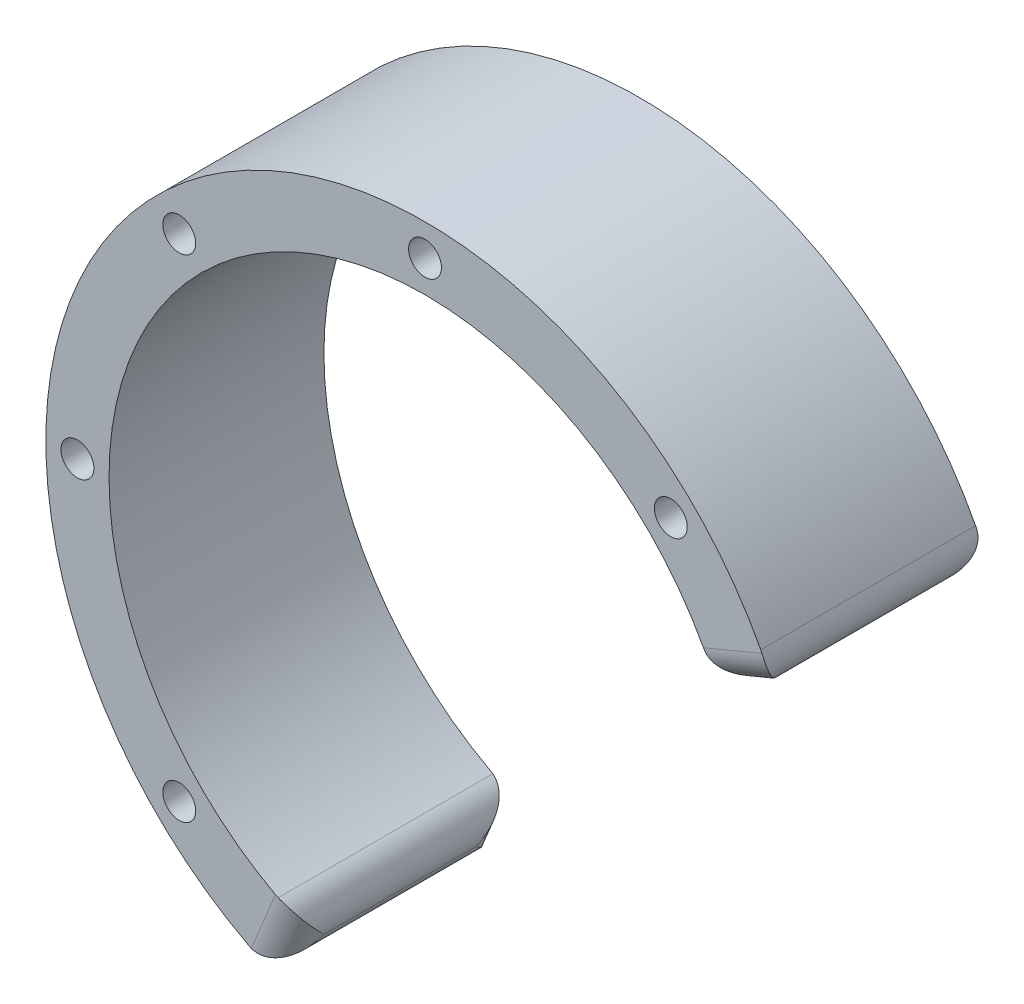
ISO-10303-21;
HEADER;
FILE_DESCRIPTION(('STEP AP214'),'2;1');
FILE_NAME('part.step','',(''),(''),'','','');
FILE_SCHEMA(('AUTOMOTIVE_DESIGN { 1 0 10303 214 1 1 1 1 }'));
ENDSEC;
DATA;
#1=APPLICATION_CONTEXT('core data for automotive mechanical design processes');
#2=APPLICATION_PROTOCOL_DEFINITION('international standard','automotive_design',2000,#1);
#3=PRODUCT_CONTEXT('',#1,'mechanical');
#4=PRODUCT('Part','Part','',(#3));
#5=PRODUCT_RELATED_PRODUCT_CATEGORY('part','',(#4));
#6=PRODUCT_DEFINITION_FORMATION('','',#4);
#7=PRODUCT_DEFINITION_CONTEXT('part definition',#1,'design');
#8=PRODUCT_DEFINITION('design','',#6,#7);
#9=PRODUCT_DEFINITION_SHAPE('','',#8);
#10=(LENGTH_UNIT() NAMED_UNIT(*) SI_UNIT(.MILLI.,.METRE.));
#11=(NAMED_UNIT(*) PLANE_ANGLE_UNIT() SI_UNIT($,.RADIAN.));
#12=(NAMED_UNIT(*) SI_UNIT($,.STERADIAN.) SOLID_ANGLE_UNIT());
#13=UNCERTAINTY_MEASURE_WITH_UNIT(LENGTH_MEASURE(1.E-05),#10,'distance_accuracy_value','');
#14=(GEOMETRIC_REPRESENTATION_CONTEXT(3) GLOBAL_UNCERTAINTY_ASSIGNED_CONTEXT((#13)) GLOBAL_UNIT_ASSIGNED_CONTEXT((#10,
#11,#12)) REPRESENTATION_CONTEXT('',''));
#15=CARTESIAN_POINT('',(0.,0.,0.));
#16=DIRECTION('',(0.,0.,1.));
#17=DIRECTION('',(1.,0.,0.));
#18=AXIS2_PLACEMENT_3D('',#15,#16,#17);
#19=CARTESIAN_POINT('',(0.,0.,-34.));
#20=DIRECTION('',(0.,0.,-1.));
#21=DIRECTION('',(1.,0.,0.));
#22=AXIS2_PLACEMENT_3D('',#19,#20,#21);
#23=PLANE('',#22);
#24=CARTESIAN_POINT('',(-55.,0.,-34.));
#25=DIRECTION('',(0.,0.,1.));
#26=DIRECTION('',(1.,0.,0.));
#27=AXIS2_PLACEMENT_3D('',#24,#25,#26);
#28=CIRCLE('',#27,2.6);
#29=CARTESIAN_POINT('',(-52.4,0.,-34.));
#30=VERTEX_POINT('',#29);
#31=EDGE_CURVE('E505',#30,#30,#28,.T.);
#32=ORIENTED_EDGE('',*,*,#31,.T.);
#33=EDGE_LOOP('',(#32));
#34=FACE_BOUND('',#33,.T.);
#35=CARTESIAN_POINT('',(0.,55.,-34.));
#36=DIRECTION('',(0.,0.,1.));
#37=DIRECTION('',(1.,0.,0.));
#38=AXIS2_PLACEMENT_3D('',#35,#36,#37);
#39=CIRCLE('',#38,2.6);
#40=CARTESIAN_POINT('',(2.6,55.,-34.));
#41=VERTEX_POINT('',#40);
#42=EDGE_CURVE('E484',#41,#41,#39,.T.);
#43=ORIENTED_EDGE('',*,*,#42,.T.);
#44=EDGE_LOOP('',(#43));
#45=FACE_BOUND('',#44,.T.);
#46=CARTESIAN_POINT('',(38.8908729652601,38.8908729652601,-34.));
#47=DIRECTION('',(0.,0.,1.));
#48=DIRECTION('',(1.,0.,0.));
#49=AXIS2_PLACEMENT_3D('',#46,#47,#48);
#50=CIRCLE('',#49,2.6);
#51=CARTESIAN_POINT('',(41.4908729652601,38.8908729652601,-34.));
#52=VERTEX_POINT('',#51);
#53=EDGE_CURVE('E490',#52,#52,#50,.T.);
#54=ORIENTED_EDGE('',*,*,#53,.T.);
#55=EDGE_LOOP('',(#54));
#56=FACE_BOUND('',#55,.T.);
#57=CARTESIAN_POINT('',(-38.8908729652601,-38.8908729652601,-34.));
#58=DIRECTION('',(0.,0.,1.));
#59=DIRECTION('',(1.,0.,0.));
#60=AXIS2_PLACEMENT_3D('',#57,#58,#59);
#61=CIRCLE('',#60,2.6);
#62=CARTESIAN_POINT('',(-36.2908729652601,-38.8908729652601,-34.));
#63=VERTEX_POINT('',#62);
#64=EDGE_CURVE('E499',#63,#63,#61,.T.);
#65=ORIENTED_EDGE('',*,*,#64,.T.);
#66=EDGE_LOOP('',(#65));
#67=FACE_BOUND('',#66,.T.);
#68=CARTESIAN_POINT('',(-38.8908729652601,38.8908729652601,-34.));
#69=DIRECTION('',(0.,0.,1.));
#70=DIRECTION('',(1.,0.,0.));
#71=AXIS2_PLACEMENT_3D('',#68,#69,#70);
#72=CIRCLE('',#71,2.6);
#73=CARTESIAN_POINT('',(-36.2908729652601,38.8908729652601,-34.));
#74=VERTEX_POINT('',#73);
#75=EDGE_CURVE('E513',#74,#74,#72,.T.);
#76=ORIENTED_EDGE('',*,*,#75,.T.);
#77=EDGE_LOOP('',(#76));
#78=FACE_BOUND('',#77,.T.);
#79=DIRECTION('',(0.923879532511288,0.382683432365087,0.));
#80=VECTOR('',#79,1.);
#81=CARTESIAN_POINT('',(-1.91341716182544,4.61939766255644,-34.));
#82=LINE('',#81,#80);
#83=CARTESIAN_POINT('',(44.049009250608,23.6576580421616,-34.));
#84=VERTEX_POINT('',#83);
#85=CARTESIAN_POINT('',(53.308946538107,27.493249653368,-34.));
#86=VERTEX_POINT('',#85);
#87=EDGE_CURVE('E244',#84,#86,#82,.T.);
#88=ORIENTED_EDGE('',*,*,#87,.F.);
#89=CARTESIAN_POINT('',(0.,0.,-34.));
#90=DIRECTION('',(0.,0.,1.));
#91=DIRECTION('',(1.,0.,0.));
#92=AXIS2_PLACEMENT_3D('',#89,#90,#91);
#93=CIRCLE('',#92,50.);
#94=CARTESIAN_POINT('',(-23.6576580421617,-44.0490092506079,-34.));
#95=VERTEX_POINT('',#94);
#96=EDGE_CURVE('E292',#84,#95,#93,.T.);
#97=ORIENTED_EDGE('',*,*,#96,.T.);
#98=DIRECTION('',(-0.382683432365091,-0.923879532511287,0.));
#99=VECTOR('',#98,1.);
#100=CARTESIAN_POINT('',(-23.753569280811,-44.2805594637389,-34.));
#101=LINE('',#100,#99);
#102=CARTESIAN_POINT('',(-27.4932496533681,-53.3089465381069,-34.));
#103=VERTEX_POINT('',#102);
#104=EDGE_CURVE('E236',#103,#95,#101,.F.);
#105=ORIENTED_EDGE('',*,*,#104,.F.);
#106=CARTESIAN_POINT('',(-25.5798324915427,-48.6895488755505,-34.));
#107=DIRECTION('',(0.,0.,1.));
#108=DIRECTION('',(1.,0.,0.));
#109=AXIS2_PLACEMENT_3D('',#106,#107,#108);
#110=CIRCLE('',#109,5.);
#111=CARTESIAN_POINT('',(-27.9052718089557,-53.1158715006005,-34.));
#112=VERTEX_POINT('',#111);
#113=EDGE_CURVE('E240',#112,#103,#110,.T.);
#114=ORIENTED_EDGE('',*,*,#113,.F.);
#115=CARTESIAN_POINT('',(0.,0.,-34.));
#116=DIRECTION('',(0.,0.,1.));
#117=DIRECTION('',(1.,0.,0.));
#118=AXIS2_PLACEMENT_3D('',#115,#116,#117);
#119=CIRCLE('',#118,60.);
#120=CARTESIAN_POINT('',(53.1158715006006,27.9052718089555,-34.));
#121=VERTEX_POINT('',#120);
#122=EDGE_CURVE('E221',#121,#112,#119,.T.);
#123=ORIENTED_EDGE('',*,*,#122,.F.);
#124=CARTESIAN_POINT('',(48.6895488755505,25.5798324915425,-34.));
#125=DIRECTION('',(0.,0.,1.));
#126=DIRECTION('',(1.,0.,0.));
#127=AXIS2_PLACEMENT_3D('',#124,#125,#126);
#128=CIRCLE('',#127,5.);
#129=EDGE_CURVE('E249',#86,#121,#128,.T.);
#130=ORIENTED_EDGE('',*,*,#129,.F.);
#131=EDGE_LOOP('',(#88,#97,#105,#114,#123,#130));
#132=FACE_BOUND('',#131,.T.);
#133=ADVANCED_FACE('F45',(#34,#45,#56,#67,#78,#132),#23,.T.);
#134=CARTESIAN_POINT('',(0.,0.,0.));
#135=DIRECTION('',(0.,0.,-1.));
#136=DIRECTION('',(1.,0.,0.));
#137=AXIS2_PLACEMENT_3D('',#134,#135,#136);
#138=PLANE('',#137);
#139=CARTESIAN_POINT('',(-38.8908729652601,38.8908729652601,0.));
#140=DIRECTION('',(0.,0.,1.));
#141=DIRECTION('',(1.,0.,0.));
#142=AXIS2_PLACEMENT_3D('',#139,#140,#141);
#143=CIRCLE('',#142,2.6);
#144=CARTESIAN_POINT('',(-36.2908729652601,38.8908729652601,0.));
#145=VERTEX_POINT('',#144);
#146=EDGE_CURVE('E516',#145,#145,#143,.T.);
#147=ORIENTED_EDGE('',*,*,#146,.F.);
#148=EDGE_LOOP('',(#147));
#149=FACE_BOUND('',#148,.T.);
#150=CARTESIAN_POINT('',(-55.,0.,0.));
#151=DIRECTION('',(0.,0.,1.));
#152=DIRECTION('',(1.,0.,0.));
#153=AXIS2_PLACEMENT_3D('',#150,#151,#152);
#154=CIRCLE('',#153,2.6);
#155=CARTESIAN_POINT('',(-52.4,0.,0.));
#156=VERTEX_POINT('',#155);
#157=EDGE_CURVE('E509',#156,#156,#154,.T.);
#158=ORIENTED_EDGE('',*,*,#157,.F.);
#159=EDGE_LOOP('',(#158));
#160=FACE_BOUND('',#159,.T.);
#161=CARTESIAN_POINT('',(-38.8908729652601,-38.8908729652601,0.));
#162=DIRECTION('',(0.,0.,1.));
#163=DIRECTION('',(1.,0.,0.));
#164=AXIS2_PLACEMENT_3D('',#161,#162,#163);
#165=CIRCLE('',#164,2.6);
#166=CARTESIAN_POINT('',(-36.2908729652601,-38.8908729652601,0.));
#167=VERTEX_POINT('',#166);
#168=EDGE_CURVE('E501',#167,#167,#165,.T.);
#169=ORIENTED_EDGE('',*,*,#168,.F.);
#170=EDGE_LOOP('',(#169));
#171=FACE_BOUND('',#170,.T.);
#172=CARTESIAN_POINT('',(38.8908729652601,38.8908729652601,0.));
#173=DIRECTION('',(0.,0.,1.));
#174=DIRECTION('',(1.,0.,0.));
#175=AXIS2_PLACEMENT_3D('',#172,#173,#174);
#176=CIRCLE('',#175,2.6);
#177=CARTESIAN_POINT('',(41.4908729652601,38.8908729652601,0.));
#178=VERTEX_POINT('',#177);
#179=EDGE_CURVE('E494',#178,#178,#176,.T.);
#180=ORIENTED_EDGE('',*,*,#179,.F.);
#181=EDGE_LOOP('',(#180));
#182=FACE_BOUND('',#181,.T.);
#183=CARTESIAN_POINT('',(0.,55.,0.));
#184=DIRECTION('',(0.,0.,1.));
#185=DIRECTION('',(1.,0.,0.));
#186=AXIS2_PLACEMENT_3D('',#183,#184,#185);
#187=CIRCLE('',#186,2.6);
#188=CARTESIAN_POINT('',(2.6,55.,0.));
#189=VERTEX_POINT('',#188);
#190=EDGE_CURVE('E487',#189,#189,#187,.T.);
#191=ORIENTED_EDGE('',*,*,#190,.F.);
#192=EDGE_LOOP('',(#191));
#193=FACE_BOUND('',#192,.T.);
#194=CARTESIAN_POINT('',(0.,0.,0.));
#195=DIRECTION('',(0.,0.,1.));
#196=DIRECTION('',(1.,0.,0.));
#197=AXIS2_PLACEMENT_3D('',#194,#195,#196);
#198=CIRCLE('',#197,60.);
#199=CARTESIAN_POINT('',(53.1158715006006,27.9052718089555,0.));
#200=VERTEX_POINT('',#199);
#201=CARTESIAN_POINT('',(-27.9052718089557,-53.1158715006005,0.));
#202=VERTEX_POINT('',#201);
#203=EDGE_CURVE('E237',#200,#202,#198,.T.);
#204=ORIENTED_EDGE('',*,*,#203,.T.);
#205=CARTESIAN_POINT('',(-25.5798324915427,-48.6895488755505,0.));
#206=DIRECTION('',(0.,0.,1.));
#207=DIRECTION('',(1.,0.,0.));
#208=AXIS2_PLACEMENT_3D('',#205,#206,#207);
#209=CIRCLE('',#208,5.);
#210=CARTESIAN_POINT('',(-27.4932496533681,-53.3089465381069,0.));
#211=VERTEX_POINT('',#210);
#212=EDGE_CURVE('E260',#211,#202,#209,.F.);
#213=ORIENTED_EDGE('',*,*,#212,.F.);
#214=DIRECTION('',(-0.382683432365091,-0.923879532511287,0.));
#215=VECTOR('',#214,1.);
#216=CARTESIAN_POINT('',(-4.61939766255643,1.91341716182545,0.));
#217=LINE('',#216,#215);
#218=CARTESIAN_POINT('',(-23.6576580421617,-44.0490092506079,0.));
#219=VERTEX_POINT('',#218);
#220=EDGE_CURVE('E113',#219,#211,#217,.T.);
#221=ORIENTED_EDGE('',*,*,#220,.F.);
#222=CARTESIAN_POINT('',(0.,0.,0.));
#223=DIRECTION('',(0.,0.,1.));
#224=DIRECTION('',(1.,0.,0.));
#225=AXIS2_PLACEMENT_3D('',#222,#223,#224);
#226=CIRCLE('',#225,50.);
#227=CARTESIAN_POINT('',(44.049009250608,23.6576580421616,0.));
#228=VERTEX_POINT('',#227);
#229=EDGE_CURVE('E130',#228,#219,#226,.T.);
#230=ORIENTED_EDGE('',*,*,#229,.F.);
#231=DIRECTION('',(0.923879532511288,0.382683432365087,0.));
#232=VECTOR('',#231,1.);
#233=CARTESIAN_POINT('',(44.280559463739,23.7535692808108,0.));
#234=LINE('',#233,#232);
#235=CARTESIAN_POINT('',(53.308946538107,27.493249653368,0.));
#236=VERTEX_POINT('',#235);
#237=EDGE_CURVE('E265',#236,#228,#234,.F.);
#238=ORIENTED_EDGE('',*,*,#237,.F.);
#239=CARTESIAN_POINT('',(48.6895488755505,25.5798324915425,0.));
#240=DIRECTION('',(0.,0.,1.));
#241=DIRECTION('',(1.,0.,0.));
#242=AXIS2_PLACEMENT_3D('',#239,#240,#241);
#243=CIRCLE('',#242,5.);
#244=EDGE_CURVE('E268',#200,#236,#243,.F.);
#245=ORIENTED_EDGE('',*,*,#244,.F.);
#246=EDGE_LOOP('',(#204,#213,#221,#230,#238,#245));
#247=FACE_BOUND('',#246,.T.);
#248=ADVANCED_FACE('F200',(#149,#160,#171,#182,#193,#247),#138,.F.);
#249=CARTESIAN_POINT('',(0.,0.,-34.));
#250=DIRECTION('',(0.,0.,1.));
#251=DIRECTION('',(-1.,0.,0.));
#252=AXIS2_PLACEMENT_3D('',#249,#250,#251);
#253=CYLINDRICAL_SURFACE('',#252,60.);
#254=ORIENTED_EDGE('',*,*,#122,.T.);
#255=DIRECTION('',(0.,0.,1.));
#256=VECTOR('',#255,1.);
#257=CARTESIAN_POINT('',(-27.9052718089557,-53.1158715006005,-34.));
#258=LINE('',#257,#256);
#259=EDGE_CURVE('E226',#202,#112,#258,.F.);
#260=ORIENTED_EDGE('',*,*,#259,.F.);
#261=ORIENTED_EDGE('',*,*,#203,.F.);
#262=DIRECTION('',(0.,0.,1.));
#263=VECTOR('',#262,1.);
#264=CARTESIAN_POINT('',(53.1158715006006,27.9052718089555,-34.));
#265=LINE('',#264,#263);
#266=EDGE_CURVE('E229',#121,#200,#265,.T.);
#267=ORIENTED_EDGE('',*,*,#266,.F.);
#268=EDGE_LOOP('',(#254,#260,#261,#267));
#269=FACE_BOUND('',#268,.T.);
#270=ADVANCED_FACE('F157',(#269),#253,.T.);
#271=CARTESIAN_POINT('',(0.,0.,-34.));
#272=DIRECTION('',(0.,0.,1.));
#273=DIRECTION('',(-1.,0.,0.));
#274=AXIS2_PLACEMENT_3D('',#271,#272,#273);
#275=CYLINDRICAL_SURFACE('',#274,50.);
#276=ORIENTED_EDGE('',*,*,#229,.T.);
#277=CARTESIAN_POINT('',(-23.2543931741297,-44.2632262505004,-0.0207040226803054));
#278=CARTESIAN_POINT('',(-23.3216288534228,-44.2279037169782,-0.0138028967598055));
#279=CARTESIAN_POINT('',(-23.3888520987387,-44.1923910335594,-0.00862699857619675));
#280=CARTESIAN_POINT('',(-23.5232737214161,-44.1209853669285,-0.00172565768276146));
#281=CARTESIAN_POINT('',(-23.5904720987775,-44.0850923837165,-2.14972935010914E-07));
#282=CARTESIAN_POINT('',(-23.6576580421617,-44.0490092506079,0.));
#283=B_SPLINE_CURVE_WITH_KNOTS('',3,(#277,#278,#279,#280,#281,#282),.UNSPECIFIED.,.F.,.F.,(4,2,
4),(0.,0.228609159588413,0.457218319176832),.UNSPECIFIED.);
#284=CARTESIAN_POINT('',(-23.2543931741297,-44.2632262505004,-0.0207040226803054));
#285=VERTEX_POINT('',#284);
#286=EDGE_CURVE('E174',#285,#219,#283,.T.);
#287=ORIENTED_EDGE('',*,*,#286,.F.);
#288=DIRECTION('',(0.,0.,1.));
#289=VECTOR('',#288,1.);
#290=CARTESIAN_POINT('',(-23.2543931741297,-44.2632262505004,-34.));
#291=LINE('',#290,#289);
#292=CARTESIAN_POINT('',(-23.2543931741297,-44.2632262505004,-33.9792959773197));
#293=VERTEX_POINT('',#292);
#294=EDGE_CURVE('E106',#293,#285,#291,.T.);
#295=ORIENTED_EDGE('',*,*,#294,.F.);
#296=CARTESIAN_POINT('',(-23.6576580421617,-44.0490092506079,-34.));
#297=CARTESIAN_POINT('',(-23.5904720987775,-44.0850923837165,-33.9999997850271));
#298=CARTESIAN_POINT('',(-23.5232737214161,-44.1209853669285,-33.9982743423172));
#299=CARTESIAN_POINT('',(-23.3888520987387,-44.1923910335594,-33.9913730014238));
#300=CARTESIAN_POINT('',(-23.3216288534228,-44.2279037169782,-33.9861971032402));
#301=CARTESIAN_POINT('',(-23.2543931741297,-44.2632262505004,-33.9792959773197));
#302=B_SPLINE_CURVE_WITH_KNOTS('',3,(#296,#297,#298,#299,#300,#301),.UNSPECIFIED.,.F.,.F.,(4,2,
4),(0.,0.228609159588419,0.457218319176836),.UNSPECIFIED.);
#303=EDGE_CURVE('E164',#95,#293,#302,.T.);
#304=ORIENTED_EDGE('',*,*,#303,.F.);
#305=ORIENTED_EDGE('',*,*,#96,.F.);
#306=CARTESIAN_POINT('',(44.2632262505005,23.2543931741296,-33.9792959773197));
#307=CARTESIAN_POINT('',(44.2279037169783,23.3216288534227,-33.9861971032402));
#308=CARTESIAN_POINT('',(44.1923910335594,23.3888520987386,-33.9913730014238));
#309=CARTESIAN_POINT('',(44.1209853669286,23.5232737214159,-33.9982743423172));
#310=CARTESIAN_POINT('',(44.0850923837166,23.5904720987774,-33.9999997850271));
#311=CARTESIAN_POINT('',(44.049009250608,23.6576580421616,-34.));
#312=B_SPLINE_CURVE_WITH_KNOTS('',3,(#306,#307,#308,#309,#310,#311),.UNSPECIFIED.,.F.,.F.,(4,2,
4),(0.,0.228609159588414,0.45721831917683),.UNSPECIFIED.);
#313=CARTESIAN_POINT('',(44.2632262505005,23.2543931741296,-33.9792959773197));
#314=VERTEX_POINT('',#313);
#315=EDGE_CURVE('E179',#314,#84,#312,.T.);
#316=ORIENTED_EDGE('',*,*,#315,.F.);
#317=DIRECTION('',(0.,0.,1.));
#318=VECTOR('',#317,1.);
#319=CARTESIAN_POINT('',(44.2632262505005,23.2543931741296,-34.));
#320=LINE('',#319,#318);
#321=CARTESIAN_POINT('',(44.2632262505005,23.2543931741296,-0.0207040226803054));
#322=VERTEX_POINT('',#321);
#323=EDGE_CURVE('E57',#322,#314,#320,.F.);
#324=ORIENTED_EDGE('',*,*,#323,.F.);
#325=CARTESIAN_POINT('',(44.049009250608,23.6576580421616,0.));
#326=CARTESIAN_POINT('',(44.0850923837166,23.5904720987774,-2.14972934691426E-07));
#327=CARTESIAN_POINT('',(44.1209853669286,23.5232737214159,-0.00172565768276111));
#328=CARTESIAN_POINT('',(44.1923910335594,23.3888520987386,-0.00862699857619739));
#329=CARTESIAN_POINT('',(44.2279037169783,23.3216288534227,-0.0138028967598073));
#330=CARTESIAN_POINT('',(44.2632262505005,23.2543931741296,-0.0207040226803089));
#331=B_SPLINE_CURVE_WITH_KNOTS('',3,(#325,#326,#327,#328,#329,#330),.UNSPECIFIED.,.F.,.F.,(4,2,
4),(0.,0.228609159588416,0.457218319176832),.UNSPECIFIED.);
#332=EDGE_CURVE('E11',#228,#322,#331,.T.);
#333=ORIENTED_EDGE('',*,*,#332,.F.);
#334=EDGE_LOOP('',(#276,#287,#295,#304,#305,#316,#324,#333));
#335=FACE_BOUND('',#334,.T.);
#336=ADVANCED_FACE('F152',(#335),#275,.F.);
#337=CARTESIAN_POINT('',(0.,55.,-34.));
#338=DIRECTION('',(0.,0.,1.));
#339=DIRECTION('',(-1.,0.,0.));
#340=AXIS2_PLACEMENT_3D('',#337,#338,#339);
#341=CYLINDRICAL_SURFACE('',#340,2.6);
#342=ORIENTED_EDGE('',*,*,#42,.F.);
#343=EDGE_LOOP('',(#342));
#344=FACE_BOUND('',#343,.T.);
#345=ORIENTED_EDGE('',*,*,#190,.T.);
#346=EDGE_LOOP('',(#345));
#347=FACE_BOUND('',#346,.T.);
#348=ADVANCED_FACE('F156',(#344,#347),#341,.F.);
#349=CARTESIAN_POINT('',(38.8908729652601,38.8908729652601,-34.));
#350=DIRECTION('',(0.,0.,1.));
#351=DIRECTION('',(-1.,0.,0.));
#352=AXIS2_PLACEMENT_3D('',#349,#350,#351);
#353=CYLINDRICAL_SURFACE('',#352,2.6);
#354=ORIENTED_EDGE('',*,*,#53,.F.);
#355=EDGE_LOOP('',(#354));
#356=FACE_BOUND('',#355,.T.);
#357=ORIENTED_EDGE('',*,*,#179,.T.);
#358=EDGE_LOOP('',(#357));
#359=FACE_BOUND('',#358,.T.);
#360=ADVANCED_FACE('F374',(#356,#359),#353,.F.);
#361=CARTESIAN_POINT('',(-38.8908729652601,-38.8908729652601,-34.));
#362=DIRECTION('',(0.,0.,1.));
#363=DIRECTION('',(-1.,0.,0.));
#364=AXIS2_PLACEMENT_3D('',#361,#362,#363);
#365=CYLINDRICAL_SURFACE('',#364,2.6);
#366=ORIENTED_EDGE('',*,*,#64,.F.);
#367=EDGE_LOOP('',(#366));
#368=FACE_BOUND('',#367,.T.);
#369=ORIENTED_EDGE('',*,*,#168,.T.);
#370=EDGE_LOOP('',(#369));
#371=FACE_BOUND('',#370,.T.);
#372=ADVANCED_FACE('F364',(#368,#371),#365,.F.);
#373=CARTESIAN_POINT('',(-55.,0.,-34.));
#374=DIRECTION('',(0.,0.,1.));
#375=DIRECTION('',(-1.,0.,0.));
#376=AXIS2_PLACEMENT_3D('',#373,#374,#375);
#377=CYLINDRICAL_SURFACE('',#376,2.6);
#378=ORIENTED_EDGE('',*,*,#31,.F.);
#379=EDGE_LOOP('',(#378));
#380=FACE_BOUND('',#379,.T.);
#381=ORIENTED_EDGE('',*,*,#157,.T.);
#382=EDGE_LOOP('',(#381));
#383=FACE_BOUND('',#382,.T.);
#384=ADVANCED_FACE('F354',(#380,#383),#377,.F.);
#385=CARTESIAN_POINT('',(-38.8908729652601,38.8908729652601,-34.));
#386=DIRECTION('',(0.,0.,1.));
#387=DIRECTION('',(-1.,0.,0.));
#388=AXIS2_PLACEMENT_3D('',#385,#386,#387);
#389=CYLINDRICAL_SURFACE('',#388,2.6);
#390=ORIENTED_EDGE('',*,*,#75,.F.);
#391=EDGE_LOOP('',(#390));
#392=FACE_BOUND('',#391,.T.);
#393=ORIENTED_EDGE('',*,*,#146,.T.);
#394=EDGE_LOOP('',(#393));
#395=FACE_BOUND('',#394,.T.);
#396=ADVANCED_FACE('F159',(#392,#395),#389,.F.);
#397=CARTESIAN_POINT('',(-1.91341716182544,4.61939766255644,-5.));
#398=DIRECTION('',(-0.923879532511288,-0.382683432365087,0.));
#399=DIRECTION('',(0.382683432365087,-0.923879532511288,0.));
#400=AXIS2_PLACEMENT_3D('',#397,#398,#399);
#401=CYLINDRICAL_SURFACE('',#400,5.);
#402=CARTESIAN_POINT('',(48.6895488755505,25.5798324915425,-5.));
#403=DIRECTION('',(-0.653281482438189,-0.270598050073097,-0.707106781186547));
#404=DIRECTION('',(-0.653281482438189,-0.270598050073097,0.707106781186547));
#405=AXIS2_PLACEMENT_3D('',#402,#403,#404);
#406=ELLIPSE('',#405,7.07106781186547,5.);
#407=CARTESIAN_POINT('',(50.602966037376,20.9604348289861,-5.));
#408=VERTEX_POINT('',#407);
#409=EDGE_CURVE('E66',#322,#408,#406,.F.);
#410=ORIENTED_EDGE('',*,*,#409,.T.);
#411=CARTESIAN_POINT('',(48.6895488755505,25.5798324915425,-5.));
#412=DIRECTION('',(0.653281482438189,0.270598050073097,-0.707106781186547));
#413=DIRECTION('',(-0.653281482438189,-0.270598050073097,-0.707106781186547));
#414=AXIS2_PLACEMENT_3D('',#411,#412,#413);
#415=ELLIPSE('',#414,7.07106781186547,5.);
#416=EDGE_CURVE('E135',#408,#236,#415,.F.);
#417=ORIENTED_EDGE('',*,*,#416,.T.);
#418=ORIENTED_EDGE('',*,*,#237,.T.);
#419=ORIENTED_EDGE('',*,*,#332,.T.);
#420=EDGE_LOOP('',(#410,#417,#418,#419));
#421=FACE_BOUND('',#420,.T.);
#422=ADVANCED_FACE('F148',(#421),#401,.T.);
#423=CARTESIAN_POINT('',(48.6895488755505,25.5798324915425,-34.));
#424=DIRECTION('',(0.,0.,1.));
#425=DIRECTION('',(-1.,0.,0.));
#426=AXIS2_PLACEMENT_3D('',#423,#424,#425);
#427=CYLINDRICAL_SURFACE('',#426,5.);
#428=CARTESIAN_POINT('',(48.6895488755505,25.5798324915425,-29.));
#429=DIRECTION('',(-0.653281482438189,-0.270598050073097,0.707106781186547));
#430=DIRECTION('',(0.653281482438189,0.270598050073097,0.707106781186547));
#431=AXIS2_PLACEMENT_3D('',#428,#429,#430);
#432=ELLIPSE('',#431,7.07106781186547,5.);
#433=CARTESIAN_POINT('',(50.602966037376,20.9604348289861,-29.));
#434=VERTEX_POINT('',#433);
#435=EDGE_CURVE('E131',#314,#434,#432,.T.);
#436=ORIENTED_EDGE('',*,*,#435,.T.);
#437=DIRECTION('',(0.,0.,1.));
#438=VECTOR('',#437,1.);
#439=CARTESIAN_POINT('',(50.602966037376,20.9604348289861,0.));
#440=LINE('',#439,#438);
#441=EDGE_CURVE('E120',#434,#408,#440,.T.);
#442=ORIENTED_EDGE('',*,*,#441,.T.);
#443=ORIENTED_EDGE('',*,*,#409,.F.);
#444=ORIENTED_EDGE('',*,*,#323,.T.);
#445=EDGE_LOOP('',(#436,#442,#443,#444));
#446=FACE_BOUND('',#445,.T.);
#447=ADVANCED_FACE('F191',(#446),#427,.T.);
#448=CARTESIAN_POINT('',(-1.91341716182544,4.61939766255644,-29.));
#449=DIRECTION('',(0.923879532511288,0.382683432365087,0.));
#450=DIRECTION('',(-0.382683432365087,0.923879532511288,0.));
#451=AXIS2_PLACEMENT_3D('',#448,#449,#450);
#452=CYLINDRICAL_SURFACE('',#451,5.);
#453=ORIENTED_EDGE('',*,*,#315,.T.);
#454=ORIENTED_EDGE('',*,*,#87,.T.);
#455=CARTESIAN_POINT('',(48.6895488755505,25.5798324915425,-29.));
#456=DIRECTION('',(-0.653281482438189,-0.270598050073097,-0.707106781186547));
#457=DIRECTION('',(0.653281482438189,0.270598050073097,-0.707106781186547));
#458=AXIS2_PLACEMENT_3D('',#455,#456,#457);
#459=ELLIPSE('',#458,7.07106781186547,5.);
#460=EDGE_CURVE('E116',#86,#434,#459,.T.);
#461=ORIENTED_EDGE('',*,*,#460,.T.);
#462=ORIENTED_EDGE('',*,*,#435,.F.);
#463=EDGE_LOOP('',(#453,#454,#461,#462));
#464=FACE_BOUND('',#463,.T.);
#465=ADVANCED_FACE('F186',(#464),#452,.T.);
#466=CARTESIAN_POINT('',(48.6895488755505,25.5798324915425,-34.));
#467=DIRECTION('',(0.,0.,1.));
#468=DIRECTION('',(-1.,0.,0.));
#469=AXIS2_PLACEMENT_3D('',#466,#467,#468);
#470=CYLINDRICAL_SURFACE('',#469,5.);
#471=ORIENTED_EDGE('',*,*,#244,.T.);
#472=ORIENTED_EDGE('',*,*,#416,.F.);
#473=ORIENTED_EDGE('',*,*,#441,.F.);
#474=ORIENTED_EDGE('',*,*,#460,.F.);
#475=ORIENTED_EDGE('',*,*,#129,.T.);
#476=ORIENTED_EDGE('',*,*,#266,.T.);
#477=EDGE_LOOP('',(#471,#472,#473,#474,#475,#476));
#478=FACE_BOUND('',#477,.T.);
#479=ADVANCED_FACE('F190',(#478),#470,.T.);
#480=CARTESIAN_POINT('',(-4.61939766255643,1.91341716182545,-5.));
#481=DIRECTION('',(-0.382683432365091,-0.923879532511287,0.));
#482=DIRECTION('',(0.923879532511287,-0.382683432365091,0.));
#483=AXIS2_PLACEMENT_3D('',#480,#481,#482);
#484=CYLINDRICAL_SURFACE('',#483,5.);
#485=CARTESIAN_POINT('',(-25.5798324915427,-48.6895488755505,-5.));
#486=DIRECTION('',(-0.270598050073099,-0.653281482438188,-0.707106781186547));
#487=DIRECTION('',(-0.270598050073099,-0.653281482438188,0.707106781186547));
#488=AXIS2_PLACEMENT_3D('',#485,#486,#487);
#489=ELLIPSE('',#488,7.07106781186547,5.);
#490=CARTESIAN_POINT('',(-20.9604348289863,-50.6029660373759,-5.));
#491=VERTEX_POINT('',#490);
#492=EDGE_CURVE('E50',#211,#491,#489,.F.);
#493=ORIENTED_EDGE('',*,*,#492,.T.);
#494=CARTESIAN_POINT('',(-25.5798324915427,-48.6895488755505,-5.));
#495=DIRECTION('',(0.270598050073099,0.653281482438188,-0.707106781186547));
#496=DIRECTION('',(-0.270598050073099,-0.653281482438188,-0.707106781186547));
#497=AXIS2_PLACEMENT_3D('',#494,#495,#496);
#498=ELLIPSE('',#497,7.07106781186547,5.);
#499=EDGE_CURVE('E100',#491,#285,#498,.F.);
#500=ORIENTED_EDGE('',*,*,#499,.T.);
#501=ORIENTED_EDGE('',*,*,#286,.T.);
#502=ORIENTED_EDGE('',*,*,#220,.T.);
#503=EDGE_LOOP('',(#493,#500,#501,#502));
#504=FACE_BOUND('',#503,.T.);
#505=ADVANCED_FACE('F47',(#504),#484,.T.);
#506=CARTESIAN_POINT('',(-25.5798324915427,-48.6895488755505,-34.));
#507=DIRECTION('',(0.,0.,1.));
#508=DIRECTION('',(-1.,0.,0.));
#509=AXIS2_PLACEMENT_3D('',#506,#507,#508);
#510=CYLINDRICAL_SURFACE('',#509,5.);
#511=CARTESIAN_POINT('',(-25.5798324915427,-48.6895488755505,-29.));
#512=DIRECTION('',(-0.270598050073099,-0.653281482438188,0.707106781186547));
#513=DIRECTION('',(0.270598050073099,0.653281482438188,0.707106781186547));
#514=AXIS2_PLACEMENT_3D('',#511,#512,#513);
#515=ELLIPSE('',#514,7.07106781186547,5.);
#516=CARTESIAN_POINT('',(-20.9604348289863,-50.6029660373759,-29.));
#517=VERTEX_POINT('',#516);
#518=EDGE_CURVE('E97',#103,#517,#515,.T.);
#519=ORIENTED_EDGE('',*,*,#518,.T.);
#520=DIRECTION('',(0.,0.,1.));
#521=VECTOR('',#520,1.);
#522=CARTESIAN_POINT('',(-20.9604348289863,-50.6029660373759,0.));
#523=LINE('',#522,#521);
#524=EDGE_CURVE('E89',#517,#491,#523,.T.);
#525=ORIENTED_EDGE('',*,*,#524,.T.);
#526=ORIENTED_EDGE('',*,*,#492,.F.);
#527=ORIENTED_EDGE('',*,*,#212,.T.);
#528=ORIENTED_EDGE('',*,*,#259,.T.);
#529=ORIENTED_EDGE('',*,*,#113,.T.);
#530=EDGE_LOOP('',(#519,#525,#526,#527,#528,#529));
#531=FACE_BOUND('',#530,.T.);
#532=ADVANCED_FACE('F91',(#531),#510,.T.);
#533=CARTESIAN_POINT('',(-4.61939766255643,1.91341716182545,-29.));
#534=DIRECTION('',(0.382683432365091,0.923879532511287,0.));
#535=DIRECTION('',(-0.923879532511287,0.382683432365091,0.));
#536=AXIS2_PLACEMENT_3D('',#533,#534,#535);
#537=CYLINDRICAL_SURFACE('',#536,5.);
#538=ORIENTED_EDGE('',*,*,#104,.T.);
#539=ORIENTED_EDGE('',*,*,#303,.T.);
#540=CARTESIAN_POINT('',(-25.5798324915427,-48.6895488755505,-29.));
#541=DIRECTION('',(-0.270598050073099,-0.653281482438188,-0.707106781186547));
#542=DIRECTION('',(0.270598050073099,0.653281482438188,-0.707106781186547));
#543=AXIS2_PLACEMENT_3D('',#540,#541,#542);
#544=ELLIPSE('',#543,7.07106781186547,5.);
#545=EDGE_CURVE('E83',#293,#517,#544,.T.);
#546=ORIENTED_EDGE('',*,*,#545,.T.);
#547=ORIENTED_EDGE('',*,*,#518,.F.);
#548=EDGE_LOOP('',(#538,#539,#546,#547));
#549=FACE_BOUND('',#548,.T.);
#550=ADVANCED_FACE('F313',(#549),#537,.T.);
#551=CARTESIAN_POINT('',(-25.5798324915427,-48.6895488755505,-34.));
#552=DIRECTION('',(0.,0.,1.));
#553=DIRECTION('',(-1.,0.,0.));
#554=AXIS2_PLACEMENT_3D('',#551,#552,#553);
#555=CYLINDRICAL_SURFACE('',#554,5.);
#556=ORIENTED_EDGE('',*,*,#499,.F.);
#557=ORIENTED_EDGE('',*,*,#524,.F.);
#558=ORIENTED_EDGE('',*,*,#545,.F.);
#559=ORIENTED_EDGE('',*,*,#294,.T.);
#560=EDGE_LOOP('',(#556,#557,#558,#559));
#561=FACE_BOUND('',#560,.T.);
#562=ADVANCED_FACE('F104',(#561),#555,.T.);
#563=CLOSED_SHELL('',(#133,#248,#270,#336,#348,#360,#372,#384,#396,#422,#447,#465,#479,#505,
#532,#550,#562));
#564=MANIFOLD_SOLID_BREP('B2',#563);
#565=ADVANCED_BREP_SHAPE_REPRESENTATION('',(#18,#564),#14);
#566=SHAPE_DEFINITION_REPRESENTATION(#9,#565);
ENDSEC;
END-ISO-10303-21;
